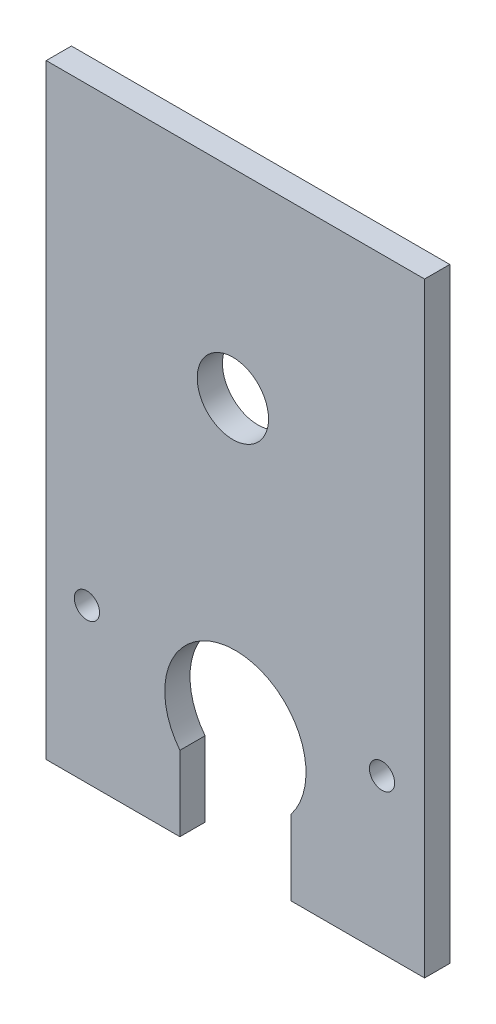
ISO-10303-21;
HEADER;
FILE_DESCRIPTION(('STEP AP214'),'2;1');
FILE_NAME('part.step','',(''),(''),'','','');
FILE_SCHEMA(('AUTOMOTIVE_DESIGN { 1 0 10303 214 1 1 1 1 }'));
ENDSEC;
DATA;
#1=APPLICATION_CONTEXT('core data for automotive mechanical design processes');
#2=APPLICATION_PROTOCOL_DEFINITION('international standard','automotive_design',2000,#1);
#3=PRODUCT_CONTEXT('',#1,'mechanical');
#4=PRODUCT('Part','Part','',(#3));
#5=PRODUCT_RELATED_PRODUCT_CATEGORY('part','',(#4));
#6=PRODUCT_DEFINITION_FORMATION('','',#4);
#7=PRODUCT_DEFINITION_CONTEXT('part definition',#1,'design');
#8=PRODUCT_DEFINITION('design','',#6,#7);
#9=PRODUCT_DEFINITION_SHAPE('','',#8);
#10=(LENGTH_UNIT() NAMED_UNIT(*) SI_UNIT(.MILLI.,.METRE.));
#11=(NAMED_UNIT(*) PLANE_ANGLE_UNIT() SI_UNIT($,.RADIAN.));
#12=(NAMED_UNIT(*) SI_UNIT($,.STERADIAN.) SOLID_ANGLE_UNIT());
#13=UNCERTAINTY_MEASURE_WITH_UNIT(LENGTH_MEASURE(1.E-05),#10,'distance_accuracy_value','');
#14=(GEOMETRIC_REPRESENTATION_CONTEXT(3) GLOBAL_UNCERTAINTY_ASSIGNED_CONTEXT((#13)) GLOBAL_UNIT_ASSIGNED_CONTEXT((#10,
#11,#12)) REPRESENTATION_CONTEXT('',''));
#15=CARTESIAN_POINT('',(0.,0.,0.));
#16=DIRECTION('',(0.,0.,1.));
#17=DIRECTION('',(1.,0.,0.));
#18=AXIS2_PLACEMENT_3D('',#15,#16,#17);
#19=CARTESIAN_POINT('',(0.,0.,10.));
#20=DIRECTION('',(0.,1.,0.));
#21=DIRECTION('',(0.,0.,1.));
#22=AXIS2_PLACEMENT_3D('',#19,#20,#21);
#23=PLANE('',#22);
#24=DIRECTION('',(1.,0.,0.));
#25=VECTOR('',#24,1.);
#26=CARTESIAN_POINT('',(0.,0.,0.));
#27=LINE('',#26,#25);
#28=CARTESIAN_POINT('',(0.,0.,0.));
#29=VERTEX_POINT('',#28);
#30=CARTESIAN_POINT('',(53.,0.,0.));
#31=VERTEX_POINT('',#30);
#32=EDGE_CURVE('E116',#29,#31,#27,.T.);
#33=ORIENTED_EDGE('',*,*,#32,.T.);
#34=DIRECTION('',(0.,0.,1.));
#35=VECTOR('',#34,1.);
#36=CARTESIAN_POINT('',(53.,0.,0.));
#37=LINE('',#36,#35);
#38=CARTESIAN_POINT('',(53.,0.,10.));
#39=VERTEX_POINT('',#38);
#40=EDGE_CURVE('E104',#31,#39,#37,.T.);
#41=ORIENTED_EDGE('',*,*,#40,.T.);
#42=DIRECTION('',(1.,0.,0.));
#43=VECTOR('',#42,1.);
#44=CARTESIAN_POINT('',(0.,0.,10.));
#45=LINE('',#44,#43);
#46=CARTESIAN_POINT('',(0.,0.,10.));
#47=VERTEX_POINT('',#46);
#48=EDGE_CURVE('E115',#47,#39,#45,.T.);
#49=ORIENTED_EDGE('',*,*,#48,.F.);
#50=DIRECTION('',(0.,0.,-1.));
#51=VECTOR('',#50,1.);
#52=CARTESIAN_POINT('',(0.,0.,10.));
#53=LINE('',#52,#51);
#54=EDGE_CURVE('E11',#47,#29,#53,.T.);
#55=ORIENTED_EDGE('',*,*,#54,.T.);
#56=EDGE_LOOP('',(#33,#41,#49,#55));
#57=FACE_BOUND('',#56,.T.);
#58=ADVANCED_FACE('F35',(#57),#23,.F.);
#59=CARTESIAN_POINT('',(0.,0.,10.));
#60=DIRECTION('',(1.,0.,0.));
#61=DIRECTION('',(0.,0.,-1.));
#62=AXIS2_PLACEMENT_3D('',#59,#60,#61);
#63=PLANE('',#62);
#64=DIRECTION('',(0.,-1.,0.));
#65=VECTOR('',#64,1.);
#66=CARTESIAN_POINT('',(0.,0.,0.));
#67=LINE('',#66,#65);
#68=CARTESIAN_POINT('',(0.,240.,0.));
#69=VERTEX_POINT('',#68);
#70=EDGE_CURVE('E157',#69,#29,#67,.T.);
#71=ORIENTED_EDGE('',*,*,#70,.T.);
#72=ORIENTED_EDGE('',*,*,#54,.F.);
#73=DIRECTION('',(0.,-1.,0.));
#74=VECTOR('',#73,1.);
#75=CARTESIAN_POINT('',(0.,0.,10.));
#76=LINE('',#75,#74);
#77=CARTESIAN_POINT('',(0.,240.,10.));
#78=VERTEX_POINT('',#77);
#79=EDGE_CURVE('E121',#78,#47,#76,.T.);
#80=ORIENTED_EDGE('',*,*,#79,.F.);
#81=DIRECTION('',(0.,0.,-1.));
#82=VECTOR('',#81,1.);
#83=CARTESIAN_POINT('',(0.,240.,10.));
#84=LINE('',#83,#82);
#85=EDGE_CURVE('E131',#78,#69,#84,.T.);
#86=ORIENTED_EDGE('',*,*,#85,.T.);
#87=EDGE_LOOP('',(#71,#72,#80,#86));
#88=FACE_BOUND('',#87,.T.);
#89=ADVANCED_FACE('F37',(#88),#63,.F.);
#90=CARTESIAN_POINT('',(97.,0.,10.));
#91=VERTEX_POINT('',#90);
#92=CARTESIAN_POINT('',(150.,0.,10.));
#93=VERTEX_POINT('',#92);
#94=EDGE_CURVE('E124',#91,#93,#45,.T.);
#95=ORIENTED_EDGE('',*,*,#94,.F.);
#96=DIRECTION('',(0.,0.,1.));
#97=VECTOR('',#96,1.);
#98=CARTESIAN_POINT('',(97.,0.,0.));
#99=LINE('',#98,#97);
#100=CARTESIAN_POINT('',(97.,0.,0.));
#101=VERTEX_POINT('',#100);
#102=EDGE_CURVE('E117',#101,#91,#99,.T.);
#103=ORIENTED_EDGE('',*,*,#102,.F.);
#104=CARTESIAN_POINT('',(150.,0.,0.));
#105=VERTEX_POINT('',#104);
#106=EDGE_CURVE('E151',#101,#105,#27,.T.);
#107=ORIENTED_EDGE('',*,*,#106,.T.);
#108=DIRECTION('',(0.,0.,-1.));
#109=VECTOR('',#108,1.);
#110=CARTESIAN_POINT('',(150.,0.,10.));
#111=LINE('',#110,#109);
#112=EDGE_CURVE('E43',#93,#105,#111,.T.);
#113=ORIENTED_EDGE('',*,*,#112,.F.);
#114=EDGE_LOOP('',(#95,#103,#107,#113));
#115=FACE_BOUND('',#114,.T.);
#116=ADVANCED_FACE('F219',(#115),#23,.F.);
#117=CARTESIAN_POINT('',(150.,0.,10.));
#118=DIRECTION('',(-1.,0.,0.));
#119=DIRECTION('',(0.,0.,1.));
#120=AXIS2_PLACEMENT_3D('',#117,#118,#119);
#121=PLANE('',#120);
#122=DIRECTION('',(0.,1.,0.));
#123=VECTOR('',#122,1.);
#124=CARTESIAN_POINT('',(150.,0.,0.));
#125=LINE('',#124,#123);
#126=CARTESIAN_POINT('',(150.,240.,0.));
#127=VERTEX_POINT('',#126);
#128=EDGE_CURVE('E143',#105,#127,#125,.T.);
#129=ORIENTED_EDGE('',*,*,#128,.T.);
#130=DIRECTION('',(0.,0.,-1.));
#131=VECTOR('',#130,1.);
#132=CARTESIAN_POINT('',(150.,240.,10.));
#133=LINE('',#132,#131);
#134=CARTESIAN_POINT('',(150.,240.,10.));
#135=VERTEX_POINT('',#134);
#136=EDGE_CURVE('E134',#135,#127,#133,.T.);
#137=ORIENTED_EDGE('',*,*,#136,.F.);
#138=DIRECTION('',(0.,1.,0.));
#139=VECTOR('',#138,1.);
#140=CARTESIAN_POINT('',(150.,0.,10.));
#141=LINE('',#140,#139);
#142=EDGE_CURVE('E123',#93,#135,#141,.T.);
#143=ORIENTED_EDGE('',*,*,#142,.F.);
#144=ORIENTED_EDGE('',*,*,#112,.T.);
#145=EDGE_LOOP('',(#129,#137,#143,#144));
#146=FACE_BOUND('',#145,.T.);
#147=ADVANCED_FACE('F141',(#146),#121,.F.);
#148=CARTESIAN_POINT('',(0.,240.,10.));
#149=DIRECTION('',(0.,-1.,0.));
#150=DIRECTION('',(0.,0.,-1.));
#151=AXIS2_PLACEMENT_3D('',#148,#149,#150);
#152=PLANE('',#151);
#153=DIRECTION('',(-1.,0.,0.));
#154=VECTOR('',#153,1.);
#155=CARTESIAN_POINT('',(0.,240.,0.));
#156=LINE('',#155,#154);
#157=EDGE_CURVE('E153',#127,#69,#156,.T.);
#158=ORIENTED_EDGE('',*,*,#157,.T.);
#159=ORIENTED_EDGE('',*,*,#85,.F.);
#160=DIRECTION('',(-1.,0.,0.));
#161=VECTOR('',#160,1.);
#162=CARTESIAN_POINT('',(0.,240.,10.));
#163=LINE('',#162,#161);
#164=EDGE_CURVE('E58',#135,#78,#163,.T.);
#165=ORIENTED_EDGE('',*,*,#164,.F.);
#166=ORIENTED_EDGE('',*,*,#136,.T.);
#167=EDGE_LOOP('',(#158,#159,#165,#166));
#168=FACE_BOUND('',#167,.T.);
#169=ADVANCED_FACE('F209',(#168),#152,.F.);
#170=CARTESIAN_POINT('',(0.,240.,10.));
#171=DIRECTION('',(0.,0.,-1.));
#172=DIRECTION('',(-1.,0.,0.));
#173=AXIS2_PLACEMENT_3D('',#170,#171,#172);
#174=PLANE('',#173);
#175=CARTESIAN_POINT('',(133.142927736259,61.,10.));
#176=DIRECTION('',(0.,0.,-1.));
#177=DIRECTION('',(-1.,0.,0.));
#178=AXIS2_PLACEMENT_3D('',#175,#176,#177);
#179=CIRCLE('',#178,4.99999999999999);
#180=CARTESIAN_POINT('',(128.142927736259,61.,10.));
#181=VERTEX_POINT('',#180);
#182=EDGE_CURVE('E184',#181,#181,#179,.T.);
#183=ORIENTED_EDGE('',*,*,#182,.T.);
#184=EDGE_LOOP('',(#183));
#185=FACE_BOUND('',#184,.T.);
#186=CARTESIAN_POINT('',(16.1429277362592,61.,10.0000000000002));
#187=DIRECTION('',(0.,0.,-1.));
#188=DIRECTION('',(-1.,0.,0.));
#189=AXIS2_PLACEMENT_3D('',#186,#187,#188);
#190=CIRCLE('',#189,5.);
#191=CARTESIAN_POINT('',(11.1429277362592,61.,10.0000000000002));
#192=VERTEX_POINT('',#191);
#193=EDGE_CURVE('E178',#192,#192,#190,.T.);
#194=ORIENTED_EDGE('',*,*,#193,.T.);
#195=EDGE_LOOP('',(#194));
#196=FACE_BOUND('',#195,.T.);
#197=CARTESIAN_POINT('',(74.,161.,10.));
#198=DIRECTION('',(0.,0.,1.));
#199=DIRECTION('',(1.,0.,0.));
#200=AXIS2_PLACEMENT_3D('',#197,#198,#199);
#201=CIRCLE('',#200,14.1421356237309);
#202=CARTESIAN_POINT('',(88.142135623731,161.,10.));
#203=VERTEX_POINT('',#202);
#204=EDGE_CURVE('E175',#203,#203,#201,.T.);
#205=ORIENTED_EDGE('',*,*,#204,.F.);
#206=EDGE_LOOP('',(#205));
#207=FACE_BOUND('',#206,.T.);
#208=ORIENTED_EDGE('',*,*,#48,.T.);
#209=DIRECTION('',(0.,-1.,0.));
#210=VECTOR('',#209,1.);
#211=CARTESIAN_POINT('',(53.,0.,10.));
#212=LINE('',#211,#210);
#213=CARTESIAN_POINT('',(53.,29.6794919243112,10.));
#214=VERTEX_POINT('',#213);
#215=EDGE_CURVE('E100',#214,#39,#212,.T.);
#216=ORIENTED_EDGE('',*,*,#215,.F.);
#217=CARTESIAN_POINT('',(75.,47.,10.));
#218=DIRECTION('',(0.,0.,1.));
#219=DIRECTION('',(1.,0.,0.));
#220=AXIS2_PLACEMENT_3D('',#217,#218,#219);
#221=CIRCLE('',#220,28.);
#222=CARTESIAN_POINT('',(97.,29.6794919243112,10.));
#223=VERTEX_POINT('',#222);
#224=EDGE_CURVE('E169',#223,#214,#221,.T.);
#225=ORIENTED_EDGE('',*,*,#224,.F.);
#226=DIRECTION('',(0.,1.,0.));
#227=VECTOR('',#226,1.);
#228=CARTESIAN_POINT('',(97.,0.,10.));
#229=LINE('',#228,#227);
#230=EDGE_CURVE('E110',#91,#223,#229,.T.);
#231=ORIENTED_EDGE('',*,*,#230,.F.);
#232=ORIENTED_EDGE('',*,*,#94,.T.);
#233=ORIENTED_EDGE('',*,*,#142,.T.);
#234=ORIENTED_EDGE('',*,*,#164,.T.);
#235=ORIENTED_EDGE('',*,*,#79,.T.);
#236=EDGE_LOOP('',(#208,#216,#225,#231,#232,#233,#234,#235));
#237=FACE_BOUND('',#236,.T.);
#238=ADVANCED_FACE('F119',(#185,#196,#207,#237),#174,.F.);
#239=CARTESIAN_POINT('',(0.,240.,0.));
#240=DIRECTION('',(0.,0.,-1.));
#241=DIRECTION('',(-1.,0.,0.));
#242=AXIS2_PLACEMENT_3D('',#239,#240,#241);
#243=PLANE('',#242);
#244=CARTESIAN_POINT('',(133.142927736259,61.,-2.36509350302077E-13));
#245=DIRECTION('',(0.,0.,-1.));
#246=DIRECTION('',(-1.,0.,0.));
#247=AXIS2_PLACEMENT_3D('',#244,#245,#246);
#248=CIRCLE('',#247,4.99999999999999);
#249=CARTESIAN_POINT('',(128.142927736259,61.,-2.27627566105076E-13));
#250=VERTEX_POINT('',#249);
#251=EDGE_CURVE('E187',#250,#250,#248,.T.);
#252=ORIENTED_EDGE('',*,*,#251,.F.);
#253=EDGE_LOOP('',(#252));
#254=FACE_BOUND('',#253,.T.);
#255=CARTESIAN_POINT('',(16.1429277362592,61.,0.));
#256=DIRECTION('',(0.,0.,-1.));
#257=DIRECTION('',(-1.,0.,0.));
#258=AXIS2_PLACEMENT_3D('',#255,#256,#257);
#259=CIRCLE('',#258,5.);
#260=CARTESIAN_POINT('',(11.1429277362592,61.,0.));
#261=VERTEX_POINT('',#260);
#262=EDGE_CURVE('E181',#261,#261,#259,.T.);
#263=ORIENTED_EDGE('',*,*,#262,.F.);
#264=EDGE_LOOP('',(#263));
#265=FACE_BOUND('',#264,.T.);
#266=CARTESIAN_POINT('',(74.,161.,0.));
#267=DIRECTION('',(0.,0.,1.));
#268=DIRECTION('',(1.,0.,0.));
#269=AXIS2_PLACEMENT_3D('',#266,#267,#268);
#270=CIRCLE('',#269,14.1421356237309);
#271=CARTESIAN_POINT('',(88.142135623731,161.,0.));
#272=VERTEX_POINT('',#271);
#273=EDGE_CURVE('E111',#272,#272,#270,.T.);
#274=ORIENTED_EDGE('',*,*,#273,.T.);
#275=EDGE_LOOP('',(#274));
#276=FACE_BOUND('',#275,.T.);
#277=DIRECTION('',(0.,-1.,0.));
#278=VECTOR('',#277,1.);
#279=CARTESIAN_POINT('',(53.,0.,0.));
#280=LINE('',#279,#278);
#281=CARTESIAN_POINT('',(53.,29.6794919243112,0.));
#282=VERTEX_POINT('',#281);
#283=EDGE_CURVE('E167',#282,#31,#280,.T.);
#284=ORIENTED_EDGE('',*,*,#283,.T.);
#285=ORIENTED_EDGE('',*,*,#32,.F.);
#286=ORIENTED_EDGE('',*,*,#70,.F.);
#287=ORIENTED_EDGE('',*,*,#157,.F.);
#288=ORIENTED_EDGE('',*,*,#128,.F.);
#289=ORIENTED_EDGE('',*,*,#106,.F.);
#290=DIRECTION('',(0.,1.,0.));
#291=VECTOR('',#290,1.);
#292=CARTESIAN_POINT('',(97.,0.,0.));
#293=LINE('',#292,#291);
#294=CARTESIAN_POINT('',(97.,29.6794919243112,0.));
#295=VERTEX_POINT('',#294);
#296=EDGE_CURVE('E165',#101,#295,#293,.T.);
#297=ORIENTED_EDGE('',*,*,#296,.T.);
#298=CARTESIAN_POINT('',(75.,47.,0.));
#299=DIRECTION('',(0.,0.,1.));
#300=DIRECTION('',(1.,0.,0.));
#301=AXIS2_PLACEMENT_3D('',#298,#299,#300);
#302=CIRCLE('',#301,28.);
#303=EDGE_CURVE('E50',#295,#282,#302,.T.);
#304=ORIENTED_EDGE('',*,*,#303,.T.);
#305=EDGE_LOOP('',(#284,#285,#286,#287,#288,#289,#297,#304));
#306=FACE_BOUND('',#305,.T.);
#307=ADVANCED_FACE('F149',(#254,#265,#276,#306),#243,.T.);
#308=CARTESIAN_POINT('',(53.,0.,0.));
#309=DIRECTION('',(-1.,0.,0.));
#310=DIRECTION('',(0.,0.,1.));
#311=AXIS2_PLACEMENT_3D('',#308,#309,#310);
#312=PLANE('',#311);
#313=ORIENTED_EDGE('',*,*,#215,.T.);
#314=ORIENTED_EDGE('',*,*,#40,.F.);
#315=ORIENTED_EDGE('',*,*,#283,.F.);
#316=DIRECTION('',(0.,0.,1.));
#317=VECTOR('',#316,1.);
#318=CARTESIAN_POINT('',(53.,29.6794919243112,0.));
#319=LINE('',#318,#317);
#320=EDGE_CURVE('E106',#282,#214,#319,.T.);
#321=ORIENTED_EDGE('',*,*,#320,.T.);
#322=EDGE_LOOP('',(#313,#314,#315,#321));
#323=FACE_BOUND('',#322,.T.);
#324=ADVANCED_FACE('F102',(#323),#312,.F.);
#325=CARTESIAN_POINT('',(75.,47.,0.));
#326=DIRECTION('',(0.,0.,1.));
#327=DIRECTION('',(1.,0.,0.));
#328=AXIS2_PLACEMENT_3D('',#325,#326,#327);
#329=CYLINDRICAL_SURFACE('',#328,28.);
#330=ORIENTED_EDGE('',*,*,#224,.T.);
#331=ORIENTED_EDGE('',*,*,#320,.F.);
#332=ORIENTED_EDGE('',*,*,#303,.F.);
#333=DIRECTION('',(0.,0.,1.));
#334=VECTOR('',#333,1.);
#335=CARTESIAN_POINT('',(97.,29.6794919243112,0.));
#336=LINE('',#335,#334);
#337=EDGE_CURVE('E161',#295,#223,#336,.T.);
#338=ORIENTED_EDGE('',*,*,#337,.T.);
#339=EDGE_LOOP('',(#330,#331,#332,#338));
#340=FACE_BOUND('',#339,.T.);
#341=ADVANCED_FACE('F232',(#340),#329,.F.);
#342=CARTESIAN_POINT('',(97.,0.,0.));
#343=DIRECTION('',(1.,0.,0.));
#344=DIRECTION('',(0.,0.,-1.));
#345=AXIS2_PLACEMENT_3D('',#342,#343,#344);
#346=PLANE('',#345);
#347=ORIENTED_EDGE('',*,*,#230,.T.);
#348=ORIENTED_EDGE('',*,*,#337,.F.);
#349=ORIENTED_EDGE('',*,*,#296,.F.);
#350=ORIENTED_EDGE('',*,*,#102,.T.);
#351=EDGE_LOOP('',(#347,#348,#349,#350));
#352=FACE_BOUND('',#351,.T.);
#353=ADVANCED_FACE('F204',(#352),#346,.F.);
#354=CARTESIAN_POINT('',(74.,161.,0.));
#355=DIRECTION('',(0.,0.,1.));
#356=DIRECTION('',(1.,0.,0.));
#357=AXIS2_PLACEMENT_3D('',#354,#355,#356);
#358=CYLINDRICAL_SURFACE('',#357,14.1421356237309);
#359=ORIENTED_EDGE('',*,*,#273,.F.);
#360=EDGE_LOOP('',(#359));
#361=FACE_BOUND('',#360,.T.);
#362=ORIENTED_EDGE('',*,*,#204,.T.);
#363=EDGE_LOOP('',(#362));
#364=FACE_BOUND('',#363,.T.);
#365=ADVANCED_FACE('F200',(#361,#364),#358,.F.);
#366=CARTESIAN_POINT('',(16.1429277362592,61.,10.0000000000002));
#367=DIRECTION('',(0.,0.,-1.));
#368=DIRECTION('',(-1.,0.,0.));
#369=AXIS2_PLACEMENT_3D('',#366,#367,#368);
#370=CYLINDRICAL_SURFACE('',#369,5.);
#371=ORIENTED_EDGE('',*,*,#193,.F.);
#372=EDGE_LOOP('',(#371));
#373=FACE_BOUND('',#372,.T.);
#374=ORIENTED_EDGE('',*,*,#262,.T.);
#375=EDGE_LOOP('',(#374));
#376=FACE_BOUND('',#375,.T.);
#377=ADVANCED_FACE('F203',(#373,#376),#370,.F.);
#378=CARTESIAN_POINT('',(133.142927736259,61.,10.));
#379=DIRECTION('',(0.,0.,-1.));
#380=DIRECTION('',(-1.,0.,0.));
#381=AXIS2_PLACEMENT_3D('',#378,#379,#380);
#382=CYLINDRICAL_SURFACE('',#381,4.99999999999999);
#383=ORIENTED_EDGE('',*,*,#182,.F.);
#384=EDGE_LOOP('',(#383));
#385=FACE_BOUND('',#384,.T.);
#386=ORIENTED_EDGE('',*,*,#251,.T.);
#387=EDGE_LOOP('',(#386));
#388=FACE_BOUND('',#387,.T.);
#389=ADVANCED_FACE('F191',(#385,#388),#382,.F.);
#390=CLOSED_SHELL('',(#58,#89,#116,#147,#169,#238,#307,#324,#341,#353,#365,#377,#389));
#391=MANIFOLD_SOLID_BREP('B2',#390);
#392=ADVANCED_BREP_SHAPE_REPRESENTATION('',(#18,#391),#14);
#393=SHAPE_DEFINITION_REPRESENTATION(#9,#392);
ENDSEC;
END-ISO-10303-21;
